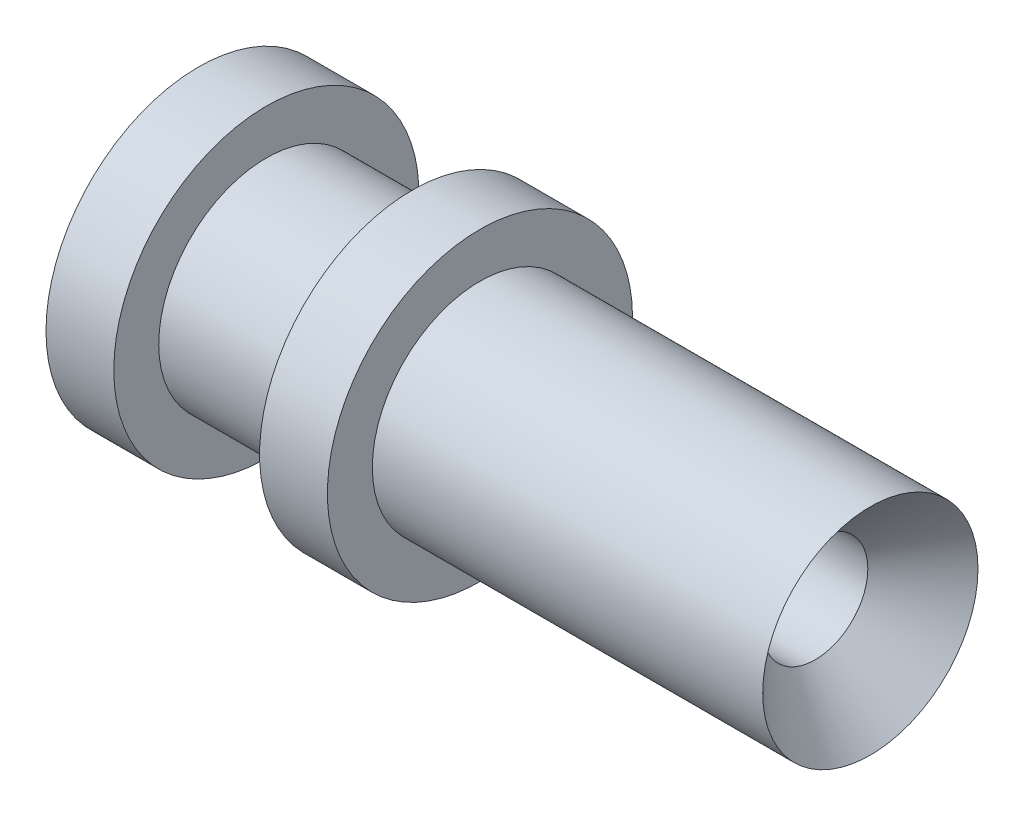
ISO-10303-21;
HEADER;
FILE_DESCRIPTION(('STEP AP214'),'2;1');
FILE_NAME('part.step','',(''),(''),'','','');
FILE_SCHEMA(('AUTOMOTIVE_DESIGN { 1 0 10303 214 1 1 1 1 }'));
ENDSEC;
DATA;
#1=APPLICATION_CONTEXT('core data for automotive mechanical design processes');
#2=APPLICATION_PROTOCOL_DEFINITION('international standard','automotive_design',2000,#1);
#3=PRODUCT_CONTEXT('',#1,'mechanical');
#4=PRODUCT('Part','Part','',(#3));
#5=PRODUCT_RELATED_PRODUCT_CATEGORY('part','',(#4));
#6=PRODUCT_DEFINITION_FORMATION('','',#4);
#7=PRODUCT_DEFINITION_CONTEXT('part definition',#1,'design');
#8=PRODUCT_DEFINITION('design','',#6,#7);
#9=PRODUCT_DEFINITION_SHAPE('','',#8);
#10=(LENGTH_UNIT() NAMED_UNIT(*) SI_UNIT(.MILLI.,.METRE.));
#11=(NAMED_UNIT(*) PLANE_ANGLE_UNIT() SI_UNIT($,.RADIAN.));
#12=(NAMED_UNIT(*) SI_UNIT($,.STERADIAN.) SOLID_ANGLE_UNIT());
#13=UNCERTAINTY_MEASURE_WITH_UNIT(LENGTH_MEASURE(1.E-05),#10,'distance_accuracy_value','');
#14=(GEOMETRIC_REPRESENTATION_CONTEXT(3) GLOBAL_UNCERTAINTY_ASSIGNED_CONTEXT((#13)) GLOBAL_UNIT_ASSIGNED_CONTEXT((#10,
#11,#12)) REPRESENTATION_CONTEXT('',''));
#15=CARTESIAN_POINT('',(0.,0.,0.));
#16=DIRECTION('',(0.,0.,1.));
#17=DIRECTION('',(1.,0.,0.));
#18=AXIS2_PLACEMENT_3D('',#15,#16,#17);
#19=CARTESIAN_POINT('',(-2.,0.,0.));
#20=DIRECTION('',(-1.,0.,0.));
#21=DIRECTION('',(0.,0.,1.));
#22=AXIS2_PLACEMENT_3D('',#19,#20,#21);
#23=PLANE('',#22);
#24=CARTESIAN_POINT('',(-2.,0.,0.));
#25=DIRECTION('',(-1.,0.,0.));
#26=DIRECTION('',(0.,0.,1.));
#27=AXIS2_PLACEMENT_3D('',#24,#25,#26);
#28=CIRCLE('',#27,4.5);
#29=CARTESIAN_POINT('',(-2.,0.,4.5));
#30=VERTEX_POINT('',#29);
#31=EDGE_CURVE('E143',#30,#30,#28,.T.);
#32=ORIENTED_EDGE('',*,*,#31,.T.);
#33=EDGE_LOOP('',(#32));
#34=FACE_BOUND('',#33,.T.);
#35=DIRECTION('',(0.,-1.,0.));
#36=VECTOR('',#35,1.);
#37=CARTESIAN_POINT('',(-2.,0.,2.8));
#38=LINE('',#37,#36);
#39=CARTESIAN_POINT('',(-2.,1.61658075373095,2.8));
#40=VERTEX_POINT('',#39);
#41=CARTESIAN_POINT('',(-2.,-1.61658075373095,2.8));
#42=VERTEX_POINT('',#41);
#43=EDGE_CURVE('E50',#40,#42,#38,.T.);
#44=ORIENTED_EDGE('',*,*,#43,.T.);
#45=DIRECTION('',(0.,-0.5,-0.866025403784439));
#46=VECTOR('',#45,1.);
#47=CARTESIAN_POINT('',(-2.,-2.42487113059643,1.4));
#48=LINE('',#47,#46);
#49=CARTESIAN_POINT('',(-2.,-3.2331615074619,0.));
#50=VERTEX_POINT('',#49);
#51=EDGE_CURVE('E11',#42,#50,#48,.T.);
#52=ORIENTED_EDGE('',*,*,#51,.T.);
#53=DIRECTION('',(0.,0.5,-0.866025403784439));
#54=VECTOR('',#53,1.);
#55=CARTESIAN_POINT('',(-2.,-2.42487113059643,-1.4));
#56=LINE('',#55,#54);
#57=CARTESIAN_POINT('',(-2.,-1.61658075373095,-2.8));
#58=VERTEX_POINT('',#57);
#59=EDGE_CURVE('E155',#50,#58,#56,.T.);
#60=ORIENTED_EDGE('',*,*,#59,.T.);
#61=DIRECTION('',(0.,1.,0.));
#62=VECTOR('',#61,1.);
#63=CARTESIAN_POINT('',(-2.,0.,-2.8));
#64=LINE('',#63,#62);
#65=CARTESIAN_POINT('',(-2.,1.61658075373095,-2.8));
#66=VERTEX_POINT('',#65);
#67=EDGE_CURVE('E160',#58,#66,#64,.T.);
#68=ORIENTED_EDGE('',*,*,#67,.T.);
#69=DIRECTION('',(0.,0.5,0.866025403784439));
#70=VECTOR('',#69,1.);
#71=CARTESIAN_POINT('',(-2.,2.42487113059643,-1.4));
#72=LINE('',#71,#70);
#73=CARTESIAN_POINT('',(-2.,3.2331615074619,0.));
#74=VERTEX_POINT('',#73);
#75=EDGE_CURVE('E163',#66,#74,#72,.T.);
#76=ORIENTED_EDGE('',*,*,#75,.T.);
#77=DIRECTION('',(0.,-0.5,0.866025403784439));
#78=VECTOR('',#77,1.);
#79=CARTESIAN_POINT('',(-2.,2.42487113059643,1.4));
#80=LINE('',#79,#78);
#81=EDGE_CURVE('E166',#74,#40,#80,.T.);
#82=ORIENTED_EDGE('',*,*,#81,.T.);
#83=EDGE_LOOP('',(#44,#52,#60,#68,#76,#82));
#84=FACE_BOUND('',#83,.T.);
#85=ADVANCED_FACE('F41',(#34,#84),#23,.T.);
#86=CARTESIAN_POINT('',(18.,0.,0.));
#87=DIRECTION('',(-1.,0.,0.));
#88=DIRECTION('',(0.,0.,1.));
#89=AXIS2_PLACEMENT_3D('',#86,#87,#88);
#90=CYLINDRICAL_SURFACE('',#89,3.175);
#91=CARTESIAN_POINT('',(0.,0.,0.));
#92=DIRECTION('',(1.,0.,0.));
#93=DIRECTION('',(0.,0.,-1.));
#94=AXIS2_PLACEMENT_3D('',#91,#92,#93);
#95=CIRCLE('',#94,3.175);
#96=CARTESIAN_POINT('',(0.,0.,-3.175));
#97=VERTEX_POINT('',#96);
#98=EDGE_CURVE('E146',#97,#97,#95,.T.);
#99=ORIENTED_EDGE('',*,*,#98,.T.);
#100=EDGE_LOOP('',(#99));
#101=FACE_BOUND('',#100,.T.);
#102=CARTESIAN_POINT('',(4.30000000000008,0.,0.));
#103=DIRECTION('',(1.,0.,0.));
#104=DIRECTION('',(0.,0.,-1.));
#105=AXIS2_PLACEMENT_3D('',#102,#103,#104);
#106=CIRCLE('',#105,3.175);
#107=CARTESIAN_POINT('',(4.30000000000008,0.,-3.175));
#108=VERTEX_POINT('',#107);
#109=EDGE_CURVE('E152',#108,#108,#106,.T.);
#110=ORIENTED_EDGE('',*,*,#109,.F.);
#111=EDGE_LOOP('',(#110));
#112=FACE_BOUND('',#111,.T.);
#113=ADVANCED_FACE('F187',(#101,#112),#90,.T.);
#114=CARTESIAN_POINT('',(-2.,0.,0.));
#115=DIRECTION('',(1.,0.,0.));
#116=DIRECTION('',(0.,0.,-1.));
#117=AXIS2_PLACEMENT_3D('',#114,#115,#116);
#118=CYLINDRICAL_SURFACE('',#117,4.5);
#119=ORIENTED_EDGE('',*,*,#31,.F.);
#120=EDGE_LOOP('',(#119));
#121=FACE_BOUND('',#120,.T.);
#122=CARTESIAN_POINT('',(0.,0.,0.));
#123=DIRECTION('',(-1.,0.,0.));
#124=DIRECTION('',(0.,0.,1.));
#125=AXIS2_PLACEMENT_3D('',#122,#123,#124);
#126=CIRCLE('',#125,4.5);
#127=CARTESIAN_POINT('',(0.,0.,4.5));
#128=VERTEX_POINT('',#127);
#129=EDGE_CURVE('E147',#128,#128,#126,.T.);
#130=ORIENTED_EDGE('',*,*,#129,.T.);
#131=EDGE_LOOP('',(#130));
#132=FACE_BOUND('',#131,.T.);
#133=ADVANCED_FACE('F215',(#121,#132),#118,.T.);
#134=CARTESIAN_POINT('',(0.,0.,0.));
#135=DIRECTION('',(-1.,0.,0.));
#136=DIRECTION('',(0.,0.,1.));
#137=AXIS2_PLACEMENT_3D('',#134,#135,#136);
#138=PLANE('',#137);
#139=ORIENTED_EDGE('',*,*,#98,.F.);
#140=EDGE_LOOP('',(#139));
#141=FACE_BOUND('',#140,.T.);
#142=ORIENTED_EDGE('',*,*,#129,.F.);
#143=EDGE_LOOP('',(#142));
#144=FACE_BOUND('',#143,.T.);
#145=ADVANCED_FACE('F199',(#141,#144),#138,.F.);
#146=CARTESIAN_POINT('',(6.30000000000008,0.,0.));
#147=DIRECTION('',(-1.,0.,0.));
#148=DIRECTION('',(0.,0.,1.));
#149=AXIS2_PLACEMENT_3D('',#146,#147,#148);
#150=CYLINDRICAL_SURFACE('',#149,4.5);
#151=CARTESIAN_POINT('',(6.30000000000008,0.,0.));
#152=DIRECTION('',(1.,0.,0.));
#153=DIRECTION('',(0.,0.,-1.));
#154=AXIS2_PLACEMENT_3D('',#151,#152,#153);
#155=CIRCLE('',#154,4.5);
#156=CARTESIAN_POINT('',(6.30000000000008,0.,-4.5));
#157=VERTEX_POINT('',#156);
#158=EDGE_CURVE('E137',#157,#157,#155,.T.);
#159=ORIENTED_EDGE('',*,*,#158,.F.);
#160=EDGE_LOOP('',(#159));
#161=FACE_BOUND('',#160,.T.);
#162=CARTESIAN_POINT('',(4.30000000000008,0.,0.));
#163=DIRECTION('',(1.,0.,0.));
#164=DIRECTION('',(0.,0.,-1.));
#165=AXIS2_PLACEMENT_3D('',#162,#163,#164);
#166=CIRCLE('',#165,4.5);
#167=CARTESIAN_POINT('',(4.30000000000008,0.,-4.5));
#168=VERTEX_POINT('',#167);
#169=EDGE_CURVE('E101',#168,#168,#166,.T.);
#170=ORIENTED_EDGE('',*,*,#169,.T.);
#171=EDGE_LOOP('',(#170));
#172=FACE_BOUND('',#171,.T.);
#173=ADVANCED_FACE('F193',(#161,#172),#150,.T.);
#174=CARTESIAN_POINT('',(6.30000000000008,0.,0.));
#175=DIRECTION('',(1.,0.,0.));
#176=DIRECTION('',(0.,0.,-1.));
#177=AXIS2_PLACEMENT_3D('',#174,#175,#176);
#178=PLANE('',#177);
#179=CARTESIAN_POINT('',(6.30000000000008,0.,0.));
#180=DIRECTION('',(1.,0.,0.));
#181=DIRECTION('',(0.,0.,-1.));
#182=AXIS2_PLACEMENT_3D('',#179,#180,#181);
#183=CIRCLE('',#182,3.175);
#184=CARTESIAN_POINT('',(6.30000000000008,0.,-3.175));
#185=VERTEX_POINT('',#184);
#186=EDGE_CURVE('E140',#185,#185,#183,.T.);
#187=ORIENTED_EDGE('',*,*,#186,.F.);
#188=EDGE_LOOP('',(#187));
#189=FACE_BOUND('',#188,.T.);
#190=ORIENTED_EDGE('',*,*,#158,.T.);
#191=EDGE_LOOP('',(#190));
#192=FACE_BOUND('',#191,.T.);
#193=ADVANCED_FACE('F190',(#189,#192),#178,.T.);
#194=CARTESIAN_POINT('',(4.30000000000008,0.,0.));
#195=DIRECTION('',(1.,0.,0.));
#196=DIRECTION('',(0.,0.,-1.));
#197=AXIS2_PLACEMENT_3D('',#194,#195,#196);
#198=PLANE('',#197);
#199=ORIENTED_EDGE('',*,*,#109,.T.);
#200=EDGE_LOOP('',(#199));
#201=FACE_BOUND('',#200,.T.);
#202=ORIENTED_EDGE('',*,*,#169,.F.);
#203=EDGE_LOOP('',(#202));
#204=FACE_BOUND('',#203,.T.);
#205=ADVANCED_FACE('F186',(#201,#204),#198,.F.);
#206=CARTESIAN_POINT('',(17.815,0.,0.));
#207=DIRECTION('',(1.,0.,0.));
#208=DIRECTION('',(0.,0.,-1.));
#209=AXIS2_PLACEMENT_3D('',#206,#207,#208);
#210=CIRCLE('',#209,3.175);
#211=CARTESIAN_POINT('',(17.815,0.,-3.175));
#212=VERTEX_POINT('',#211);
#213=EDGE_CURVE('E45',#212,#212,#210,.F.);
#214=ORIENTED_EDGE('',*,*,#213,.T.);
#215=EDGE_LOOP('',(#214));
#216=FACE_BOUND('',#215,.T.);
#217=ORIENTED_EDGE('',*,*,#186,.T.);
#218=EDGE_LOOP('',(#217));
#219=FACE_BOUND('',#218,.T.);
#220=ADVANCED_FACE('F43',(#216,#219),#90,.T.);
#221=CARTESIAN_POINT('',(-1.,0.,0.));
#222=DIRECTION('',(-1.,0.,0.));
#223=DIRECTION('',(0.,0.,1.));
#224=AXIS2_PLACEMENT_3D('',#221,#222,#223);
#225=PLANE('',#224);
#226=CARTESIAN_POINT('',(-1.,0.,0.));
#227=DIRECTION('',(-1.,0.,0.));
#228=DIRECTION('',(0.,0.,1.));
#229=AXIS2_PLACEMENT_3D('',#226,#227,#228);
#230=CIRCLE('',#229,1.55);
#231=CARTESIAN_POINT('',(-1.,0.,1.55));
#232=VERTEX_POINT('',#231);
#233=EDGE_CURVE('E118',#232,#232,#230,.T.);
#234=ORIENTED_EDGE('',*,*,#233,.F.);
#235=EDGE_LOOP('',(#234));
#236=FACE_BOUND('',#235,.T.);
#237=DIRECTION('',(0.,0.5,0.866025403784439));
#238=VECTOR('',#237,1.);
#239=CARTESIAN_POINT('',(-1.,-3.2331615074619,0.));
#240=LINE('',#239,#238);
#241=CARTESIAN_POINT('',(-1.,-3.2331615074619,0.));
#242=VERTEX_POINT('',#241);
#243=CARTESIAN_POINT('',(-1.,-1.61658075373095,2.8));
#244=VERTEX_POINT('',#243);
#245=EDGE_CURVE('E97',#242,#244,#240,.T.);
#246=ORIENTED_EDGE('',*,*,#245,.T.);
#247=DIRECTION('',(0.,1.,0.));
#248=VECTOR('',#247,1.);
#249=CARTESIAN_POINT('',(-1.,-1.61658075373095,2.8));
#250=LINE('',#249,#248);
#251=CARTESIAN_POINT('',(-1.,1.61658075373095,2.8));
#252=VERTEX_POINT('',#251);
#253=EDGE_CURVE('E105',#244,#252,#250,.T.);
#254=ORIENTED_EDGE('',*,*,#253,.T.);
#255=DIRECTION('',(0.,0.5,-0.866025403784439));
#256=VECTOR('',#255,1.);
#257=CARTESIAN_POINT('',(-1.,1.61658075373095,2.8));
#258=LINE('',#257,#256);
#259=CARTESIAN_POINT('',(-1.,3.2331615074619,0.));
#260=VERTEX_POINT('',#259);
#261=EDGE_CURVE('E111',#252,#260,#258,.T.);
#262=ORIENTED_EDGE('',*,*,#261,.T.);
#263=DIRECTION('',(0.,-0.5,-0.866025403784439));
#264=VECTOR('',#263,1.);
#265=CARTESIAN_POINT('',(-1.,3.2331615074619,0.));
#266=LINE('',#265,#264);
#267=CARTESIAN_POINT('',(-1.,1.61658075373095,-2.8));
#268=VERTEX_POINT('',#267);
#269=EDGE_CURVE('E123',#260,#268,#266,.T.);
#270=ORIENTED_EDGE('',*,*,#269,.T.);
#271=DIRECTION('',(0.,-1.,0.));
#272=VECTOR('',#271,1.);
#273=CARTESIAN_POINT('',(-1.,1.61658075373095,-2.8));
#274=LINE('',#273,#272);
#275=CARTESIAN_POINT('',(-1.,-1.61658075373095,-2.8));
#276=VERTEX_POINT('',#275);
#277=EDGE_CURVE('E126',#268,#276,#274,.T.);
#278=ORIENTED_EDGE('',*,*,#277,.T.);
#279=DIRECTION('',(0.,-0.5,0.866025403784439));
#280=VECTOR('',#279,1.);
#281=CARTESIAN_POINT('',(-1.,-1.61658075373095,-2.8));
#282=LINE('',#281,#280);
#283=EDGE_CURVE('E115',#276,#242,#282,.T.);
#284=ORIENTED_EDGE('',*,*,#283,.T.);
#285=EDGE_LOOP('',(#246,#254,#262,#270,#278,#284));
#286=FACE_BOUND('',#285,.T.);
#287=ADVANCED_FACE('F113',(#236,#286),#225,.T.);
#288=CARTESIAN_POINT('',(-2.000012,-3.2331615074619,0.));
#289=DIRECTION('',(0.,0.866025403784439,-0.5));
#290=DIRECTION('',(0.,0.5,0.866025403784439));
#291=AXIS2_PLACEMENT_3D('',#288,#289,#290);
#292=PLANE('',#291);
#293=DIRECTION('',(1.,0.,0.));
#294=VECTOR('',#293,1.);
#295=CARTESIAN_POINT('',(-2.000012,-1.61658075373095,2.8));
#296=LINE('',#295,#294);
#297=EDGE_CURVE('E93',#42,#244,#296,.T.);
#298=ORIENTED_EDGE('',*,*,#297,.T.);
#299=ORIENTED_EDGE('',*,*,#245,.F.);
#300=DIRECTION('',(1.,0.,0.));
#301=VECTOR('',#300,1.);
#302=CARTESIAN_POINT('',(-2.000012,-3.2331615074619,0.));
#303=LINE('',#302,#301);
#304=EDGE_CURVE('E129',#50,#242,#303,.T.);
#305=ORIENTED_EDGE('',*,*,#304,.F.);
#306=ORIENTED_EDGE('',*,*,#51,.F.);
#307=EDGE_LOOP('',(#298,#299,#305,#306));
#308=FACE_BOUND('',#307,.T.);
#309=ADVANCED_FACE('F95',(#308),#292,.T.);
#310=CARTESIAN_POINT('',(-2.000012,-1.61658075373095,2.8));
#311=DIRECTION('',(0.,0.,-1.));
#312=DIRECTION('',(-1.,0.,0.));
#313=AXIS2_PLACEMENT_3D('',#310,#311,#312);
#314=PLANE('',#313);
#315=DIRECTION('',(1.,0.,0.));
#316=VECTOR('',#315,1.);
#317=CARTESIAN_POINT('',(-2.000012,1.61658075373095,2.8));
#318=LINE('',#317,#316);
#319=EDGE_CURVE('E102',#40,#252,#318,.T.);
#320=ORIENTED_EDGE('',*,*,#319,.T.);
#321=ORIENTED_EDGE('',*,*,#253,.F.);
#322=ORIENTED_EDGE('',*,*,#297,.F.);
#323=ORIENTED_EDGE('',*,*,#43,.F.);
#324=EDGE_LOOP('',(#320,#321,#322,#323));
#325=FACE_BOUND('',#324,.T.);
#326=ADVANCED_FACE('F106',(#325),#314,.T.);
#327=CARTESIAN_POINT('',(-2.000012,1.61658075373095,2.8));
#328=DIRECTION('',(0.,-0.866025403784439,-0.5));
#329=DIRECTION('',(0.,0.5,-0.866025403784439));
#330=AXIS2_PLACEMENT_3D('',#327,#328,#329);
#331=PLANE('',#330);
#332=DIRECTION('',(1.,0.,0.));
#333=VECTOR('',#332,1.);
#334=CARTESIAN_POINT('',(-2.000012,3.2331615074619,0.));
#335=LINE('',#334,#333);
#336=EDGE_CURVE('E134',#74,#260,#335,.T.);
#337=ORIENTED_EDGE('',*,*,#336,.T.);
#338=ORIENTED_EDGE('',*,*,#261,.F.);
#339=ORIENTED_EDGE('',*,*,#319,.F.);
#340=ORIENTED_EDGE('',*,*,#81,.F.);
#341=EDGE_LOOP('',(#337,#338,#339,#340));
#342=FACE_BOUND('',#341,.T.);
#343=ADVANCED_FACE('F283',(#342),#331,.T.);
#344=CARTESIAN_POINT('',(-2.000012,3.2331615074619,0.));
#345=DIRECTION('',(0.,-0.866025403784439,0.5));
#346=DIRECTION('',(0.,-0.5,-0.866025403784439));
#347=AXIS2_PLACEMENT_3D('',#344,#345,#346);
#348=PLANE('',#347);
#349=DIRECTION('',(1.,0.,0.));
#350=VECTOR('',#349,1.);
#351=CARTESIAN_POINT('',(-2.000012,1.61658075373095,-2.8));
#352=LINE('',#351,#350);
#353=EDGE_CURVE('E132',#66,#268,#352,.T.);
#354=ORIENTED_EDGE('',*,*,#353,.T.);
#355=ORIENTED_EDGE('',*,*,#269,.F.);
#356=ORIENTED_EDGE('',*,*,#336,.F.);
#357=ORIENTED_EDGE('',*,*,#75,.F.);
#358=EDGE_LOOP('',(#354,#355,#356,#357));
#359=FACE_BOUND('',#358,.T.);
#360=ADVANCED_FACE('F292',(#359),#348,.T.);
#361=CARTESIAN_POINT('',(-2.000012,1.61658075373095,-2.8));
#362=DIRECTION('',(0.,0.,1.));
#363=DIRECTION('',(1.,0.,0.));
#364=AXIS2_PLACEMENT_3D('',#361,#362,#363);
#365=PLANE('',#364);
#366=DIRECTION('',(1.,0.,0.));
#367=VECTOR('',#366,1.);
#368=CARTESIAN_POINT('',(-2.000012,-1.61658075373095,-2.8));
#369=LINE('',#368,#367);
#370=EDGE_CURVE('E58',#58,#276,#369,.T.);
#371=ORIENTED_EDGE('',*,*,#370,.T.);
#372=ORIENTED_EDGE('',*,*,#277,.F.);
#373=ORIENTED_EDGE('',*,*,#353,.F.);
#374=ORIENTED_EDGE('',*,*,#67,.F.);
#375=EDGE_LOOP('',(#371,#372,#373,#374));
#376=FACE_BOUND('',#375,.T.);
#377=ADVANCED_FACE('F302',(#376),#365,.T.);
#378=CARTESIAN_POINT('',(-2.000012,-1.61658075373095,-2.8));
#379=DIRECTION('',(0.,0.866025403784439,0.5));
#380=DIRECTION('',(0.,-0.5,0.866025403784439));
#381=AXIS2_PLACEMENT_3D('',#378,#379,#380);
#382=PLANE('',#381);
#383=ORIENTED_EDGE('',*,*,#304,.T.);
#384=ORIENTED_EDGE('',*,*,#283,.F.);
#385=ORIENTED_EDGE('',*,*,#370,.F.);
#386=ORIENTED_EDGE('',*,*,#59,.F.);
#387=EDGE_LOOP('',(#383,#384,#385,#386));
#388=FACE_BOUND('',#387,.T.);
#389=ADVANCED_FACE('F180',(#388),#382,.T.);
#390=CARTESIAN_POINT('',(18.,0.,0.));
#391=DIRECTION('',(1.,0.,0.));
#392=DIRECTION('',(0.,0.,-1.));
#393=AXIS2_PLACEMENT_3D('',#390,#391,#392);
#394=CONICAL_SURFACE('',#393,3.36,0.785398163397448);
#395=CARTESIAN_POINT('',(16.19,0.,0.));
#396=DIRECTION('',(1.,0.,0.));
#397=DIRECTION('',(0.,0.,-1.));
#398=AXIS2_PLACEMENT_3D('',#395,#396,#397);
#399=CIRCLE('',#398,1.55);
#400=CARTESIAN_POINT('',(16.19,0.,-1.55));
#401=VERTEX_POINT('',#400);
#402=EDGE_CURVE('E120',#401,#401,#399,.T.);
#403=ORIENTED_EDGE('',*,*,#402,.F.);
#404=EDGE_LOOP('',(#403));
#405=FACE_BOUND('',#404,.T.);
#406=ORIENTED_EDGE('',*,*,#213,.F.);
#407=EDGE_LOOP('',(#406));
#408=FACE_BOUND('',#407,.T.);
#409=ADVANCED_FACE('F177',(#405,#408),#394,.F.);
#410=CARTESIAN_POINT('',(18.,0.,0.));
#411=DIRECTION('',(1.,0.,0.));
#412=DIRECTION('',(0.,0.,-1.));
#413=AXIS2_PLACEMENT_3D('',#410,#411,#412);
#414=CYLINDRICAL_SURFACE('',#413,1.55);
#415=ORIENTED_EDGE('',*,*,#233,.T.);
#416=EDGE_LOOP('',(#415));
#417=FACE_BOUND('',#416,.T.);
#418=ORIENTED_EDGE('',*,*,#402,.T.);
#419=EDGE_LOOP('',(#418));
#420=FACE_BOUND('',#419,.T.);
#421=ADVANCED_FACE('F175',(#417,#420),#414,.F.);
#422=CLOSED_SHELL('',(#85,#113,#133,#145,#173,#193,#205,#220,#287,#309,#326,#343,#360,#377,#389,
#409,#421));
#423=MANIFOLD_SOLID_BREP('B2',#422);
#424=ADVANCED_BREP_SHAPE_REPRESENTATION('',(#18,#423),#14);
#425=SHAPE_DEFINITION_REPRESENTATION(#9,#424);
ENDSEC;
END-ISO-10303-21;
